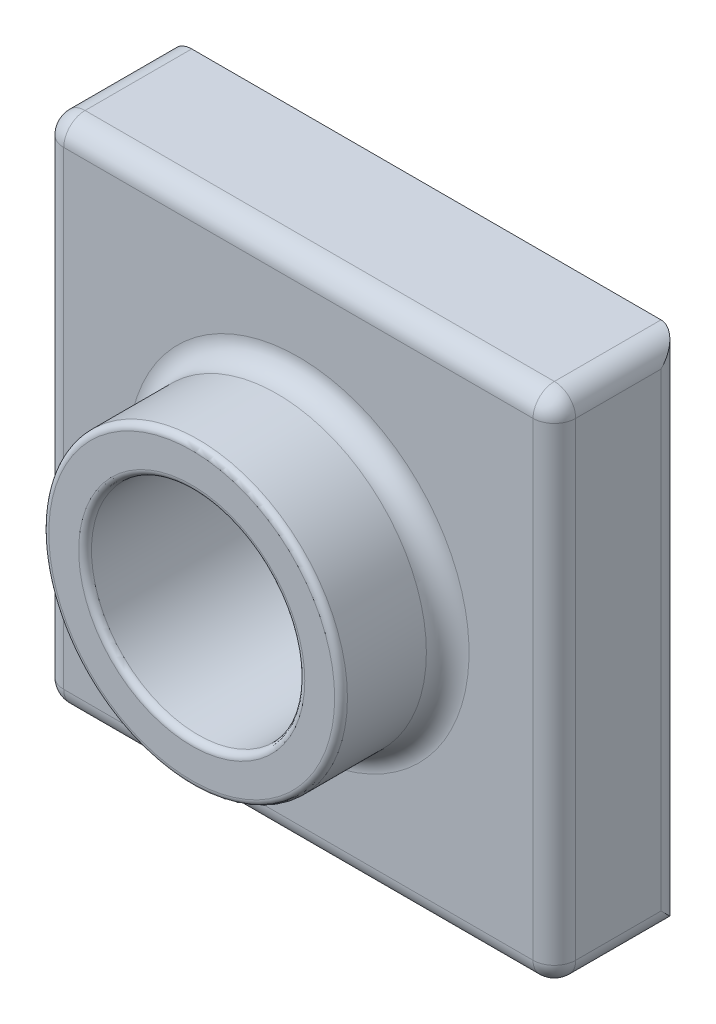
ISO-10303-21;
HEADER;
FILE_DESCRIPTION(('STEP AP214'),'2;1');
FILE_NAME('part.step','',(''),(''),'','','');
FILE_SCHEMA(('AUTOMOTIVE_DESIGN { 1 0 10303 214 1 1 1 1 }'));
ENDSEC;
DATA;
#1=APPLICATION_CONTEXT('core data for automotive mechanical design processes');
#2=APPLICATION_PROTOCOL_DEFINITION('international standard','automotive_design',2000,#1);
#3=PRODUCT_CONTEXT('',#1,'mechanical');
#4=PRODUCT('Part','Part','',(#3));
#5=PRODUCT_RELATED_PRODUCT_CATEGORY('part','',(#4));
#6=PRODUCT_DEFINITION_FORMATION('','',#4);
#7=PRODUCT_DEFINITION_CONTEXT('part definition',#1,'design');
#8=PRODUCT_DEFINITION('design','',#6,#7);
#9=PRODUCT_DEFINITION_SHAPE('','',#8);
#10=(LENGTH_UNIT() NAMED_UNIT(*) SI_UNIT(.MILLI.,.METRE.));
#11=(NAMED_UNIT(*) PLANE_ANGLE_UNIT() SI_UNIT($,.RADIAN.));
#12=(NAMED_UNIT(*) SI_UNIT($,.STERADIAN.) SOLID_ANGLE_UNIT());
#13=UNCERTAINTY_MEASURE_WITH_UNIT(LENGTH_MEASURE(1.E-05),#10,'distance_accuracy_value','');
#14=(GEOMETRIC_REPRESENTATION_CONTEXT(3) GLOBAL_UNCERTAINTY_ASSIGNED_CONTEXT((#13)) GLOBAL_UNIT_ASSIGNED_CONTEXT((#10,
#11,#12)) REPRESENTATION_CONTEXT('',''));
#15=CARTESIAN_POINT('',(0.,0.,0.));
#16=DIRECTION('',(0.,0.,1.));
#17=DIRECTION('',(1.,0.,0.));
#18=AXIS2_PLACEMENT_3D('',#15,#16,#17);
#19=CARTESIAN_POINT('',(0.,0.,0.));
#20=DIRECTION('',(0.,0.,-1.));
#21=DIRECTION('',(-1.,0.,0.));
#22=AXIS2_PLACEMENT_3D('',#19,#20,#21);
#23=PLANE('',#22);
#24=DIRECTION('',(0.,1.,0.));
#25=VECTOR('',#24,1.);
#26=CARTESIAN_POINT('',(115.,0.,0.));
#27=LINE('',#26,#25);
#28=CARTESIAN_POINT('',(115.,120.,0.));
#29=VERTEX_POINT('',#28);
#30=CARTESIAN_POINT('',(115.,118.,0.));
#31=VERTEX_POINT('',#30);
#32=EDGE_CURVE('E384',#29,#31,#27,.F.);
#33=ORIENTED_EDGE('',*,*,#32,.T.);
#34=DIRECTION('',(-1.,0.,0.));
#35=VECTOR('',#34,1.);
#36=CARTESIAN_POINT('',(0.,118.,0.));
#37=LINE('',#36,#35);
#38=CARTESIAN_POINT('',(4.99999999999998,118.,0.));
#39=VERTEX_POINT('',#38);
#40=EDGE_CURVE('E262',#31,#39,#37,.T.);
#41=ORIENTED_EDGE('',*,*,#40,.T.);
#42=CARTESIAN_POINT('',(4.99999999999999,115.,0.));
#43=DIRECTION('',(0.,0.,-1.));
#44=DIRECTION('',(-1.,0.,0.));
#45=AXIS2_PLACEMENT_3D('',#42,#43,#44);
#46=CIRCLE('',#45,3.);
#47=CARTESIAN_POINT('',(1.99999999999999,115.,0.));
#48=VERTEX_POINT('',#47);
#49=EDGE_CURVE('E303',#48,#39,#46,.T.);
#50=ORIENTED_EDGE('',*,*,#49,.F.);
#51=DIRECTION('',(0.,-1.,0.));
#52=VECTOR('',#51,1.);
#53=CARTESIAN_POINT('',(2.,0.,0.));
#54=LINE('',#53,#52);
#55=CARTESIAN_POINT('',(2.,5.,0.));
#56=VERTEX_POINT('',#55);
#57=EDGE_CURVE('E61',#48,#56,#54,.T.);
#58=ORIENTED_EDGE('',*,*,#57,.T.);
#59=CARTESIAN_POINT('',(5.,5.,0.));
#60=DIRECTION('',(0.,0.,-1.));
#61=DIRECTION('',(-1.,0.,0.));
#62=AXIS2_PLACEMENT_3D('',#59,#60,#61);
#63=CIRCLE('',#62,3.);
#64=CARTESIAN_POINT('',(5.,2.,0.));
#65=VERTEX_POINT('',#64);
#66=EDGE_CURVE('E196',#65,#56,#63,.T.);
#67=ORIENTED_EDGE('',*,*,#66,.F.);
#68=DIRECTION('',(1.,0.,0.));
#69=VECTOR('',#68,1.);
#70=CARTESIAN_POINT('',(0.,2.,0.));
#71=LINE('',#70,#69);
#72=CARTESIAN_POINT('',(115.,2.,0.));
#73=VERTEX_POINT('',#72);
#74=EDGE_CURVE('E298',#65,#73,#71,.T.);
#75=ORIENTED_EDGE('',*,*,#74,.T.);
#76=CARTESIAN_POINT('',(115.,0.,0.));
#77=VERTEX_POINT('',#76);
#78=EDGE_CURVE('E383',#73,#77,#27,.F.);
#79=ORIENTED_EDGE('',*,*,#78,.T.);
#80=DIRECTION('',(1.,0.,0.));
#81=VECTOR('',#80,1.);
#82=CARTESIAN_POINT('',(0.,0.,0.));
#83=LINE('',#82,#81);
#84=CARTESIAN_POINT('',(5.,0.,0.));
#85=VERTEX_POINT('',#84);
#86=EDGE_CURVE('E337',#85,#77,#83,.T.);
#87=ORIENTED_EDGE('',*,*,#86,.F.);
#88=CARTESIAN_POINT('',(5.,5.,0.));
#89=DIRECTION('',(0.,0.,-1.));
#90=DIRECTION('',(-1.,0.,0.));
#91=AXIS2_PLACEMENT_3D('',#88,#89,#90);
#92=CIRCLE('',#91,5.);
#93=CARTESIAN_POINT('',(0.,5.,0.));
#94=VERTEX_POINT('',#93);
#95=EDGE_CURVE('E381',#85,#94,#92,.T.);
#96=ORIENTED_EDGE('',*,*,#95,.T.);
#97=DIRECTION('',(0.,-1.,0.));
#98=VECTOR('',#97,1.);
#99=CARTESIAN_POINT('',(0.,0.,0.));
#100=LINE('',#99,#98);
#101=CARTESIAN_POINT('',(0.,115.,0.));
#102=VERTEX_POINT('',#101);
#103=EDGE_CURVE('E331',#102,#94,#100,.T.);
#104=ORIENTED_EDGE('',*,*,#103,.F.);
#105=CARTESIAN_POINT('',(4.99999999999999,115.,0.));
#106=DIRECTION('',(0.,0.,-1.));
#107=DIRECTION('',(-1.,0.,0.));
#108=AXIS2_PLACEMENT_3D('',#105,#106,#107);
#109=CIRCLE('',#108,5.);
#110=CARTESIAN_POINT('',(4.99999999999999,120.,0.));
#111=VERTEX_POINT('',#110);
#112=EDGE_CURVE('E378',#102,#111,#109,.T.);
#113=ORIENTED_EDGE('',*,*,#112,.T.);
#114=DIRECTION('',(-1.,0.,0.));
#115=VECTOR('',#114,1.);
#116=CARTESIAN_POINT('',(0.,120.,0.));
#117=LINE('',#116,#115);
#118=EDGE_CURVE('E345',#29,#111,#117,.T.);
#119=ORIENTED_EDGE('',*,*,#118,.F.);
#120=EDGE_LOOP('',(#33,#41,#50,#58,#67,#75,#79,#87,#96,#104,#113,#119));
#121=FACE_BOUND('',#120,.T.);
#122=ADVANCED_FACE('F44',(#121),#23,.T.);
#123=CARTESIAN_POINT('',(0.,0.,30.));
#124=DIRECTION('',(1.,0.,0.));
#125=DIRECTION('',(0.,1.,0.));
#126=AXIS2_PLACEMENT_3D('',#123,#124,#125);
#127=PLANE('',#126);
#128=ORIENTED_EDGE('',*,*,#103,.T.);
#129=DIRECTION('',(0.,0.,-1.));
#130=VECTOR('',#129,1.);
#131=CARTESIAN_POINT('',(0.,5.,30.));
#132=LINE('',#131,#130);
#133=CARTESIAN_POINT('',(0.,5.,25.));
#134=VERTEX_POINT('',#133);
#135=EDGE_CURVE('E69',#94,#134,#132,.F.);
#136=ORIENTED_EDGE('',*,*,#135,.T.);
#137=DIRECTION('',(0.,-1.,0.));
#138=VECTOR('',#137,1.);
#139=CARTESIAN_POINT('',(0.,0.,25.));
#140=LINE('',#139,#138);
#141=CARTESIAN_POINT('',(0.,115.,25.));
#142=VERTEX_POINT('',#141);
#143=EDGE_CURVE('E408',#134,#142,#140,.F.);
#144=ORIENTED_EDGE('',*,*,#143,.T.);
#145=DIRECTION('',(0.,0.,-1.));
#146=VECTOR('',#145,1.);
#147=CARTESIAN_POINT('',(0.,115.,30.));
#148=LINE('',#147,#146);
#149=EDGE_CURVE('E406',#142,#102,#148,.T.);
#150=ORIENTED_EDGE('',*,*,#149,.T.);
#151=EDGE_LOOP('',(#128,#136,#144,#150));
#152=FACE_BOUND('',#151,.T.);
#153=ADVANCED_FACE('F522',(#152),#127,.F.);
#154=CARTESIAN_POINT('',(0.,0.,30.));
#155=DIRECTION('',(0.,1.,0.));
#156=DIRECTION('',(0.,0.,1.));
#157=AXIS2_PLACEMENT_3D('',#154,#155,#156);
#158=PLANE('',#157);
#159=ORIENTED_EDGE('',*,*,#86,.T.);
#160=DIRECTION('',(0.,0.,-1.));
#161=VECTOR('',#160,1.);
#162=CARTESIAN_POINT('',(115.,0.,30.));
#163=LINE('',#162,#161);
#164=CARTESIAN_POINT('',(115.,0.,25.));
#165=VERTEX_POINT('',#164);
#166=EDGE_CURVE('E364',#77,#165,#163,.F.);
#167=ORIENTED_EDGE('',*,*,#166,.T.);
#168=DIRECTION('',(1.,0.,0.));
#169=VECTOR('',#168,1.);
#170=CARTESIAN_POINT('',(0.,0.,25.));
#171=LINE('',#170,#169);
#172=CARTESIAN_POINT('',(5.,0.,25.));
#173=VERTEX_POINT('',#172);
#174=EDGE_CURVE('E362',#165,#173,#171,.F.);
#175=ORIENTED_EDGE('',*,*,#174,.T.);
#176=DIRECTION('',(0.,0.,-1.));
#177=VECTOR('',#176,1.);
#178=CARTESIAN_POINT('',(5.,0.,30.));
#179=LINE('',#178,#177);
#180=EDGE_CURVE('E359',#173,#85,#179,.T.);
#181=ORIENTED_EDGE('',*,*,#180,.T.);
#182=EDGE_LOOP('',(#159,#167,#175,#181));
#183=FACE_BOUND('',#182,.T.);
#184=ADVANCED_FACE('F529',(#183),#158,.F.);
#185=CARTESIAN_POINT('',(120.,0.,30.));
#186=DIRECTION('',(-1.,0.,0.));
#187=DIRECTION('',(0.,-1.,0.));
#188=AXIS2_PLACEMENT_3D('',#185,#186,#187);
#189=PLANE('',#188);
#190=DIRECTION('',(0.,0.,-1.));
#191=VECTOR('',#190,1.);
#192=CARTESIAN_POINT('',(120.,5.,30.));
#193=LINE('',#192,#191);
#194=CARTESIAN_POINT('',(120.,5.,25.));
#195=VERTEX_POINT('',#194);
#196=CARTESIAN_POINT('',(120.,5.,5.));
#197=VERTEX_POINT('',#196);
#198=EDGE_CURVE('E355',#195,#197,#193,.T.);
#199=ORIENTED_EDGE('',*,*,#198,.T.);
#200=DIRECTION('',(0.,1.,0.));
#201=VECTOR('',#200,1.);
#202=CARTESIAN_POINT('',(120.,120.,5.));
#203=LINE('',#202,#201);
#204=CARTESIAN_POINT('',(120.,115.,5.));
#205=VERTEX_POINT('',#204);
#206=EDGE_CURVE('E358',#197,#205,#203,.T.);
#207=ORIENTED_EDGE('',*,*,#206,.T.);
#208=DIRECTION('',(0.,0.,-1.));
#209=VECTOR('',#208,1.);
#210=CARTESIAN_POINT('',(120.,115.,30.));
#211=LINE('',#210,#209);
#212=CARTESIAN_POINT('',(120.,115.,25.));
#213=VERTEX_POINT('',#212);
#214=EDGE_CURVE('E349',#205,#213,#211,.F.);
#215=ORIENTED_EDGE('',*,*,#214,.T.);
#216=DIRECTION('',(0.,1.,0.));
#217=VECTOR('',#216,1.);
#218=CARTESIAN_POINT('',(120.,0.,25.));
#219=LINE('',#218,#217);
#220=EDGE_CURVE('E347',#213,#195,#219,.F.);
#221=ORIENTED_EDGE('',*,*,#220,.T.);
#222=EDGE_LOOP('',(#199,#207,#215,#221));
#223=FACE_BOUND('',#222,.T.);
#224=ADVANCED_FACE('F990',(#223),#189,.F.);
#225=CARTESIAN_POINT('',(0.,120.,30.));
#226=DIRECTION('',(0.,-1.,0.));
#227=DIRECTION('',(0.,0.,-1.));
#228=AXIS2_PLACEMENT_3D('',#225,#226,#227);
#229=PLANE('',#228);
#230=DIRECTION('',(-1.,0.,0.));
#231=VECTOR('',#230,1.);
#232=CARTESIAN_POINT('',(0.,120.,25.));
#233=LINE('',#232,#231);
#234=CARTESIAN_POINT('',(4.99999999999999,120.,25.));
#235=VERTEX_POINT('',#234);
#236=CARTESIAN_POINT('',(115.,120.,25.));
#237=VERTEX_POINT('',#236);
#238=EDGE_CURVE('E375',#235,#237,#233,.F.);
#239=ORIENTED_EDGE('',*,*,#238,.T.);
#240=DIRECTION('',(0.,0.,-1.));
#241=VECTOR('',#240,1.);
#242=CARTESIAN_POINT('',(115.,120.,30.));
#243=LINE('',#242,#241);
#244=EDGE_CURVE('E374',#237,#29,#243,.T.);
#245=ORIENTED_EDGE('',*,*,#244,.T.);
#246=ORIENTED_EDGE('',*,*,#118,.T.);
#247=DIRECTION('',(0.,0.,-1.));
#248=VECTOR('',#247,1.);
#249=CARTESIAN_POINT('',(4.99999999999999,120.,30.));
#250=LINE('',#249,#248);
#251=EDGE_CURVE('E369',#111,#235,#250,.F.);
#252=ORIENTED_EDGE('',*,*,#251,.T.);
#253=EDGE_LOOP('',(#239,#245,#246,#252));
#254=FACE_BOUND('',#253,.T.);
#255=ADVANCED_FACE('F519',(#254),#229,.F.);
#256=CARTESIAN_POINT('',(0.,0.,30.));
#257=DIRECTION('',(0.,0.,-1.));
#258=DIRECTION('',(-1.,0.,0.));
#259=AXIS2_PLACEMENT_3D('',#256,#257,#258);
#260=PLANE('',#259);
#261=DIRECTION('',(0.,1.,0.));
#262=VECTOR('',#261,1.);
#263=CARTESIAN_POINT('',(115.,0.,30.));
#264=LINE('',#263,#262);
#265=CARTESIAN_POINT('',(115.,5.,30.));
#266=VERTEX_POINT('',#265);
#267=CARTESIAN_POINT('',(115.,115.,30.));
#268=VERTEX_POINT('',#267);
#269=EDGE_CURVE('E399',#266,#268,#264,.T.);
#270=ORIENTED_EDGE('',*,*,#269,.T.);
#271=DIRECTION('',(-1.,0.,0.));
#272=VECTOR('',#271,1.);
#273=CARTESIAN_POINT('',(0.,115.,30.));
#274=LINE('',#273,#272);
#275=CARTESIAN_POINT('',(4.99999999999999,115.,30.));
#276=VERTEX_POINT('',#275);
#277=EDGE_CURVE('E405',#268,#276,#274,.T.);
#278=ORIENTED_EDGE('',*,*,#277,.T.);
#279=DIRECTION('',(0.,-1.,0.));
#280=VECTOR('',#279,1.);
#281=CARTESIAN_POINT('',(5.,0.,30.));
#282=LINE('',#281,#280);
#283=CARTESIAN_POINT('',(5.,5.,30.));
#284=VERTEX_POINT('',#283);
#285=EDGE_CURVE('E392',#276,#284,#282,.T.);
#286=ORIENTED_EDGE('',*,*,#285,.T.);
#287=DIRECTION('',(1.,0.,0.));
#288=VECTOR('',#287,1.);
#289=CARTESIAN_POINT('',(0.,5.,30.));
#290=LINE('',#289,#288);
#291=EDGE_CURVE('E398',#284,#266,#290,.T.);
#292=ORIENTED_EDGE('',*,*,#291,.T.);
#293=EDGE_LOOP('',(#270,#278,#286,#292));
#294=FACE_BOUND('',#293,.T.);
#295=CARTESIAN_POINT('',(60.,60.,30.));
#296=DIRECTION('',(0.,0.,-1.));
#297=DIRECTION('',(-1.,0.,0.));
#298=AXIS2_PLACEMENT_3D('',#295,#296,#297);
#299=CIRCLE('',#298,40.);
#300=CARTESIAN_POINT('',(20.,60.,30.));
#301=VERTEX_POINT('',#300);
#302=EDGE_CURVE('E386',#301,#301,#299,.T.);
#303=ORIENTED_EDGE('',*,*,#302,.T.);
#304=EDGE_LOOP('',(#303));
#305=FACE_BOUND('',#304,.T.);
#306=ADVANCED_FACE('F507',(#294,#305),#260,.F.);
#307=CARTESIAN_POINT('',(60.,60.,0.));
#308=DIRECTION('',(0.,0.,-1.));
#309=DIRECTION('',(-1.,0.,0.));
#310=AXIS2_PLACEMENT_3D('',#307,#308,#309);
#311=CIRCLE('',#310,27.);
#312=CARTESIAN_POINT('',(33.,60.,0.));
#313=VERTEX_POINT('',#312);
#314=EDGE_CURVE('E299',#313,#313,#311,.F.);
#315=ORIENTED_EDGE('',*,*,#314,.F.);
#316=EDGE_LOOP('',(#315));
#317=FACE_BOUND('',#316,.T.);
#318=CARTESIAN_POINT('',(60.,60.,0.));
#319=DIRECTION('',(0.,0.,1.));
#320=DIRECTION('',(1.,0.,0.));
#321=AXIS2_PLACEMENT_3D('',#318,#319,#320);
#322=CIRCLE('',#321,25.);
#323=CARTESIAN_POINT('',(85.,60.,0.));
#324=VERTEX_POINT('',#323);
#325=EDGE_CURVE('E329',#324,#324,#322,.T.);
#326=ORIENTED_EDGE('',*,*,#325,.T.);
#327=EDGE_LOOP('',(#326));
#328=FACE_BOUND('',#327,.T.);
#329=ADVANCED_FACE('F506',(#317,#328),#23,.T.);
#330=CARTESIAN_POINT('',(60.,60.,55.));
#331=DIRECTION('',(0.,0.,-1.));
#332=DIRECTION('',(-1.,0.,0.));
#333=AXIS2_PLACEMENT_3D('',#330,#331,#332);
#334=CYLINDRICAL_SURFACE('',#333,35.);
#335=CARTESIAN_POINT('',(60.,60.,53.5));
#336=DIRECTION('',(0.,0.,1.));
#337=DIRECTION('',(1.,0.,0.));
#338=AXIS2_PLACEMENT_3D('',#335,#336,#337);
#339=CIRCLE('',#338,35.);
#340=CARTESIAN_POINT('',(95.,60.,53.5));
#341=VERTEX_POINT('',#340);
#342=EDGE_CURVE('E53',#341,#341,#339,.F.);
#343=ORIENTED_EDGE('',*,*,#342,.T.);
#344=EDGE_LOOP('',(#343));
#345=FACE_BOUND('',#344,.T.);
#346=CARTESIAN_POINT('',(60.,60.,35.));
#347=DIRECTION('',(0.,0.,-1.));
#348=DIRECTION('',(-1.,0.,0.));
#349=AXIS2_PLACEMENT_3D('',#346,#347,#348);
#350=CIRCLE('',#349,35.);
#351=CARTESIAN_POINT('',(25.,60.,35.));
#352=VERTEX_POINT('',#351);
#353=EDGE_CURVE('E414',#352,#352,#350,.F.);
#354=ORIENTED_EDGE('',*,*,#353,.T.);
#355=EDGE_LOOP('',(#354));
#356=FACE_BOUND('',#355,.T.);
#357=ADVANCED_FACE('F481',(#345,#356),#334,.T.);
#358=CARTESIAN_POINT('',(60.,60.,55.));
#359=DIRECTION('',(0.,0.,1.));
#360=DIRECTION('',(1.,0.,0.));
#361=AXIS2_PLACEMENT_3D('',#358,#359,#360);
#362=PLANE('',#361);
#363=CARTESIAN_POINT('',(60.,60.,55.));
#364=DIRECTION('',(0.,0.,1.));
#365=DIRECTION('',(1.,0.,0.));
#366=AXIS2_PLACEMENT_3D('',#363,#364,#365);
#367=CIRCLE('',#366,33.5);
#368=CARTESIAN_POINT('',(93.5,60.,55.));
#369=VERTEX_POINT('',#368);
#370=EDGE_CURVE('E475',#369,#369,#367,.T.);
#371=ORIENTED_EDGE('',*,*,#370,.T.);
#372=EDGE_LOOP('',(#371));
#373=FACE_BOUND('',#372,.T.);
#374=CARTESIAN_POINT('',(60.,60.,55.));
#375=DIRECTION('',(0.,0.,1.));
#376=DIRECTION('',(1.,0.,0.));
#377=AXIS2_PLACEMENT_3D('',#374,#375,#376);
#378=CIRCLE('',#377,26.5);
#379=CARTESIAN_POINT('',(86.5,60.,55.));
#380=VERTEX_POINT('',#379);
#381=EDGE_CURVE('E416',#380,#380,#378,.F.);
#382=ORIENTED_EDGE('',*,*,#381,.T.);
#383=EDGE_LOOP('',(#382));
#384=FACE_BOUND('',#383,.T.);
#385=ADVANCED_FACE('F489',(#373,#384),#362,.T.);
#386=CARTESIAN_POINT('',(60.,60.,0.));
#387=DIRECTION('',(0.,0.,1.));
#388=DIRECTION('',(1.,0.,0.));
#389=AXIS2_PLACEMENT_3D('',#386,#387,#388);
#390=CYLINDRICAL_SURFACE('',#389,25.);
#391=CARTESIAN_POINT('',(60.,60.,53.5));
#392=DIRECTION('',(0.,0.,1.));
#393=DIRECTION('',(1.,0.,0.));
#394=AXIS2_PLACEMENT_3D('',#391,#392,#393);
#395=CIRCLE('',#394,25.);
#396=CARTESIAN_POINT('',(85.,60.,53.5));
#397=VERTEX_POINT('',#396);
#398=EDGE_CURVE('E11',#397,#397,#395,.T.);
#399=ORIENTED_EDGE('',*,*,#398,.T.);
#400=EDGE_LOOP('',(#399));
#401=FACE_BOUND('',#400,.T.);
#402=ORIENTED_EDGE('',*,*,#325,.F.);
#403=EDGE_LOOP('',(#402));
#404=FACE_BOUND('',#403,.T.);
#405=ADVANCED_FACE('F492',(#401,#404),#390,.F.);
#406=CARTESIAN_POINT('',(4.99999999999999,115.,30.));
#407=DIRECTION('',(0.,0.,-1.));
#408=DIRECTION('',(-1.,0.,0.));
#409=AXIS2_PLACEMENT_3D('',#406,#407,#408);
#410=CYLINDRICAL_SURFACE('',#409,5.);
#411=CARTESIAN_POINT('',(4.99999999999999,115.,25.));
#412=DIRECTION('',(0.,0.,1.));
#413=DIRECTION('',(1.,0.,0.));
#414=AXIS2_PLACEMENT_3D('',#411,#412,#413);
#415=CIRCLE('',#414,5.);
#416=EDGE_CURVE('E333',#235,#142,#415,.T.);
#417=ORIENTED_EDGE('',*,*,#416,.F.);
#418=ORIENTED_EDGE('',*,*,#251,.F.);
#419=ORIENTED_EDGE('',*,*,#112,.F.);
#420=ORIENTED_EDGE('',*,*,#149,.F.);
#421=EDGE_LOOP('',(#417,#418,#419,#420));
#422=FACE_BOUND('',#421,.T.);
#423=ADVANCED_FACE('F503',(#422),#410,.T.);
#424=CARTESIAN_POINT('',(4.99999999999999,115.,25.));
#425=DIRECTION('',(-1.,0.,0.));
#426=DIRECTION('',(0.,0.,1.));
#427=AXIS2_PLACEMENT_3D('',#424,#425,#426);
#428=SPHERICAL_SURFACE('',#427,5.);
#429=CARTESIAN_POINT('',(4.99999999999999,115.,25.));
#430=DIRECTION('',(-1.,0.,0.));
#431=DIRECTION('',(0.,0.,1.));
#432=AXIS2_PLACEMENT_3D('',#429,#430,#431);
#433=CIRCLE('',#432,5.);
#434=EDGE_CURVE('E458',#235,#276,#433,.F.);
#435=ORIENTED_EDGE('',*,*,#434,.F.);
#436=ORIENTED_EDGE('',*,*,#416,.T.);
#437=CARTESIAN_POINT('',(4.99999999999999,115.,25.));
#438=DIRECTION('',(0.,1.,0.));
#439=DIRECTION('',(0.,0.,1.));
#440=AXIS2_PLACEMENT_3D('',#437,#438,#439);
#441=CIRCLE('',#440,5.);
#442=EDGE_CURVE('E463',#276,#142,#441,.F.);
#443=ORIENTED_EDGE('',*,*,#442,.F.);
#444=EDGE_LOOP('',(#435,#436,#443));
#445=FACE_BOUND('',#444,.T.);
#446=ADVANCED_FACE('F931',(#445),#428,.T.);
#447=CARTESIAN_POINT('',(5.,5.,30.));
#448=DIRECTION('',(0.,0.,-1.));
#449=DIRECTION('',(-1.,0.,0.));
#450=AXIS2_PLACEMENT_3D('',#447,#448,#449);
#451=CYLINDRICAL_SURFACE('',#450,5.);
#452=ORIENTED_EDGE('',*,*,#95,.F.);
#453=ORIENTED_EDGE('',*,*,#180,.F.);
#454=CARTESIAN_POINT('',(5.,5.,25.));
#455=DIRECTION('',(0.,0.,1.));
#456=DIRECTION('',(1.,0.,0.));
#457=AXIS2_PLACEMENT_3D('',#454,#455,#456);
#458=CIRCLE('',#457,5.);
#459=EDGE_CURVE('E457',#134,#173,#458,.T.);
#460=ORIENTED_EDGE('',*,*,#459,.F.);
#461=ORIENTED_EDGE('',*,*,#135,.F.);
#462=EDGE_LOOP('',(#452,#453,#460,#461));
#463=FACE_BOUND('',#462,.T.);
#464=ADVANCED_FACE('F921',(#463),#451,.T.);
#465=CARTESIAN_POINT('',(5.,0.,25.));
#466=DIRECTION('',(0.,-1.,0.));
#467=DIRECTION('',(1.,0.,0.));
#468=AXIS2_PLACEMENT_3D('',#465,#466,#467);
#469=CYLINDRICAL_SURFACE('',#468,5.);
#470=ORIENTED_EDGE('',*,*,#442,.T.);
#471=ORIENTED_EDGE('',*,*,#143,.F.);
#472=CARTESIAN_POINT('',(5.,5.,25.));
#473=DIRECTION('',(0.,-1.,0.));
#474=DIRECTION('',(1.,0.,0.));
#475=AXIS2_PLACEMENT_3D('',#472,#473,#474);
#476=CIRCLE('',#475,5.);
#477=EDGE_CURVE('E455',#284,#134,#476,.T.);
#478=ORIENTED_EDGE('',*,*,#477,.F.);
#479=ORIENTED_EDGE('',*,*,#285,.F.);
#480=EDGE_LOOP('',(#470,#471,#478,#479));
#481=FACE_BOUND('',#480,.T.);
#482=ADVANCED_FACE('F913',(#481),#469,.T.);
#483=CARTESIAN_POINT('',(0.,115.,25.));
#484=DIRECTION('',(-1.,0.,0.));
#485=DIRECTION('',(0.,0.,1.));
#486=AXIS2_PLACEMENT_3D('',#483,#484,#485);
#487=CYLINDRICAL_SURFACE('',#486,5.);
#488=ORIENTED_EDGE('',*,*,#434,.T.);
#489=ORIENTED_EDGE('',*,*,#277,.F.);
#490=CARTESIAN_POINT('',(115.,115.,25.));
#491=DIRECTION('',(1.,0.,0.));
#492=DIRECTION('',(0.,0.,-1.));
#493=AXIS2_PLACEMENT_3D('',#490,#491,#492);
#494=CIRCLE('',#493,5.);
#495=EDGE_CURVE('E447',#237,#268,#494,.T.);
#496=ORIENTED_EDGE('',*,*,#495,.F.);
#497=ORIENTED_EDGE('',*,*,#238,.F.);
#498=EDGE_LOOP('',(#488,#489,#496,#497));
#499=FACE_BOUND('',#498,.T.);
#500=ADVANCED_FACE('F901',(#499),#487,.T.);
#501=CARTESIAN_POINT('',(5.,5.,25.));
#502=DIRECTION('',(-1.,0.,0.));
#503=DIRECTION('',(0.,-1.,0.));
#504=AXIS2_PLACEMENT_3D('',#501,#502,#503);
#505=SPHERICAL_SURFACE('',#504,5.);
#506=ORIENTED_EDGE('',*,*,#477,.T.);
#507=ORIENTED_EDGE('',*,*,#459,.T.);
#508=CARTESIAN_POINT('',(5.,5.,25.));
#509=DIRECTION('',(-1.,0.,0.));
#510=DIRECTION('',(0.,0.,1.));
#511=AXIS2_PLACEMENT_3D('',#508,#509,#510);
#512=CIRCLE('',#511,5.);
#513=EDGE_CURVE('E441',#284,#173,#512,.F.);
#514=ORIENTED_EDGE('',*,*,#513,.F.);
#515=EDGE_LOOP('',(#506,#507,#514));
#516=FACE_BOUND('',#515,.T.);
#517=ADVANCED_FACE('F893',(#516),#505,.T.);
#518=CARTESIAN_POINT('',(115.,115.,25.));
#519=DIRECTION('',(0.,0.,1.));
#520=DIRECTION('',(1.,0.,0.));
#521=AXIS2_PLACEMENT_3D('',#518,#519,#520);
#522=SPHERICAL_SURFACE('',#521,5.);
#523=CARTESIAN_POINT('',(115.,115.,25.));
#524=DIRECTION('',(0.,0.,1.));
#525=DIRECTION('',(1.,0.,0.));
#526=AXIS2_PLACEMENT_3D('',#523,#524,#525);
#527=CIRCLE('',#526,5.);
#528=EDGE_CURVE('E436',#237,#213,#527,.F.);
#529=ORIENTED_EDGE('',*,*,#528,.F.);
#530=ORIENTED_EDGE('',*,*,#495,.T.);
#531=CARTESIAN_POINT('',(115.,115.,25.));
#532=DIRECTION('',(0.,1.,0.));
#533=DIRECTION('',(0.,0.,1.));
#534=AXIS2_PLACEMENT_3D('',#531,#532,#533);
#535=CIRCLE('',#534,5.);
#536=EDGE_CURVE('E439',#213,#268,#535,.F.);
#537=ORIENTED_EDGE('',*,*,#536,.F.);
#538=EDGE_LOOP('',(#529,#530,#537));
#539=FACE_BOUND('',#538,.T.);
#540=ADVANCED_FACE('F882',(#539),#522,.T.);
#541=CARTESIAN_POINT('',(0.,5.,25.));
#542=DIRECTION('',(1.,0.,0.));
#543=DIRECTION('',(0.,0.,-1.));
#544=AXIS2_PLACEMENT_3D('',#541,#542,#543);
#545=CYLINDRICAL_SURFACE('',#544,5.);
#546=ORIENTED_EDGE('',*,*,#513,.T.);
#547=ORIENTED_EDGE('',*,*,#174,.F.);
#548=CARTESIAN_POINT('',(115.,5.,25.));
#549=DIRECTION('',(1.,0.,0.));
#550=DIRECTION('',(0.,0.,-1.));
#551=AXIS2_PLACEMENT_3D('',#548,#549,#550);
#552=CIRCLE('',#551,5.);
#553=EDGE_CURVE('E435',#266,#165,#552,.T.);
#554=ORIENTED_EDGE('',*,*,#553,.F.);
#555=ORIENTED_EDGE('',*,*,#291,.F.);
#556=EDGE_LOOP('',(#546,#547,#554,#555));
#557=FACE_BOUND('',#556,.T.);
#558=ADVANCED_FACE('F871',(#557),#545,.T.);
#559=CARTESIAN_POINT('',(115.,0.,25.));
#560=DIRECTION('',(0.,1.,0.));
#561=DIRECTION('',(-1.,0.,0.));
#562=AXIS2_PLACEMENT_3D('',#559,#560,#561);
#563=CYLINDRICAL_SURFACE('',#562,5.);
#564=ORIENTED_EDGE('',*,*,#536,.T.);
#565=ORIENTED_EDGE('',*,*,#269,.F.);
#566=CARTESIAN_POINT('',(115.,5.,25.));
#567=DIRECTION('',(0.,-1.,0.));
#568=DIRECTION('',(1.,0.,0.));
#569=AXIS2_PLACEMENT_3D('',#566,#567,#568);
#570=CIRCLE('',#569,5.);
#571=EDGE_CURVE('E428',#195,#266,#570,.T.);
#572=ORIENTED_EDGE('',*,*,#571,.F.);
#573=ORIENTED_EDGE('',*,*,#220,.F.);
#574=EDGE_LOOP('',(#564,#565,#572,#573));
#575=FACE_BOUND('',#574,.T.);
#576=ADVANCED_FACE('F863',(#575),#563,.T.);
#577=CARTESIAN_POINT('',(115.,115.,30.));
#578=DIRECTION('',(0.,0.,-1.));
#579=DIRECTION('',(-1.,0.,0.));
#580=AXIS2_PLACEMENT_3D('',#577,#578,#579);
#581=CYLINDRICAL_SURFACE('',#580,5.);
#582=ORIENTED_EDGE('',*,*,#528,.T.);
#583=ORIENTED_EDGE('',*,*,#214,.F.);
#584=CARTESIAN_POINT('',(115.,115.,5.));
#585=DIRECTION('',(0.,-0.707106781186547,-0.707106781186547));
#586=DIRECTION('',(0.,-0.707106781186547,0.707106781186547));
#587=AXIS2_PLACEMENT_3D('',#584,#585,#586);
#588=ELLIPSE('',#587,7.07106781186547,5.);
#589=EDGE_CURVE('E424',#29,#205,#588,.T.);
#590=ORIENTED_EDGE('',*,*,#589,.F.);
#591=ORIENTED_EDGE('',*,*,#244,.F.);
#592=EDGE_LOOP('',(#582,#583,#590,#591));
#593=FACE_BOUND('',#592,.T.);
#594=ADVANCED_FACE('F853',(#593),#581,.T.);
#595=CARTESIAN_POINT('',(115.,5.,25.));
#596=DIRECTION('',(0.,0.,1.));
#597=DIRECTION('',(1.,0.,0.));
#598=AXIS2_PLACEMENT_3D('',#595,#596,#597);
#599=SPHERICAL_SURFACE('',#598,5.);
#600=ORIENTED_EDGE('',*,*,#571,.T.);
#601=ORIENTED_EDGE('',*,*,#553,.T.);
#602=CARTESIAN_POINT('',(115.,5.,25.));
#603=DIRECTION('',(0.,0.,1.));
#604=DIRECTION('',(1.,0.,0.));
#605=AXIS2_PLACEMENT_3D('',#602,#603,#604);
#606=CIRCLE('',#605,5.);
#607=EDGE_CURVE('E423',#195,#165,#606,.F.);
#608=ORIENTED_EDGE('',*,*,#607,.F.);
#609=EDGE_LOOP('',(#600,#601,#608));
#610=FACE_BOUND('',#609,.T.);
#611=ADVANCED_FACE('F841',(#610),#599,.T.);
#612=CARTESIAN_POINT('',(115.,0.,5.));
#613=DIRECTION('',(0.,-1.,0.));
#614=DIRECTION('',(1.,0.,0.));
#615=AXIS2_PLACEMENT_3D('',#612,#613,#614);
#616=CYLINDRICAL_SURFACE('',#615,5.);
#617=ORIENTED_EDGE('',*,*,#589,.T.);
#618=ORIENTED_EDGE('',*,*,#206,.F.);
#619=CARTESIAN_POINT('',(115.,5.,5.));
#620=DIRECTION('',(0.,-0.707106781186547,0.707106781186547));
#621=DIRECTION('',(0.,-0.707106781186547,-0.707106781186547));
#622=AXIS2_PLACEMENT_3D('',#619,#620,#621);
#623=ELLIPSE('',#622,7.07106781186547,5.);
#624=EDGE_CURVE('E315',#77,#197,#623,.T.);
#625=ORIENTED_EDGE('',*,*,#624,.F.);
#626=ORIENTED_EDGE('',*,*,#78,.F.);
#627=DIRECTION('',(0.,1.,0.));
#628=VECTOR('',#627,1.);
#629=CARTESIAN_POINT('',(115.,0.,0.));
#630=LINE('',#629,#628);
#631=EDGE_CURVE('E325',#31,#73,#630,.F.);
#632=ORIENTED_EDGE('',*,*,#631,.F.);
#633=ORIENTED_EDGE('',*,*,#32,.F.);
#634=EDGE_LOOP('',(#617,#618,#625,#626,#632,#633));
#635=FACE_BOUND('',#634,.T.);
#636=ADVANCED_FACE('F538',(#635),#616,.T.);
#637=CARTESIAN_POINT('',(115.,5.,30.));
#638=DIRECTION('',(0.,0.,-1.));
#639=DIRECTION('',(-1.,0.,0.));
#640=AXIS2_PLACEMENT_3D('',#637,#638,#639);
#641=CYLINDRICAL_SURFACE('',#640,5.);
#642=ORIENTED_EDGE('',*,*,#607,.T.);
#643=ORIENTED_EDGE('',*,*,#166,.F.);
#644=ORIENTED_EDGE('',*,*,#624,.T.);
#645=ORIENTED_EDGE('',*,*,#198,.F.);
#646=EDGE_LOOP('',(#642,#643,#644,#645));
#647=FACE_BOUND('',#646,.T.);
#648=ADVANCED_FACE('F823',(#647),#641,.T.);
#649=CARTESIAN_POINT('',(60.,60.,35.));
#650=DIRECTION('',(0.,0.,-1.));
#651=DIRECTION('',(-1.,0.,0.));
#652=AXIS2_PLACEMENT_3D('',#649,#650,#651);
#653=TOROIDAL_SURFACE('',#652,40.,5.);
#654=ORIENTED_EDGE('',*,*,#302,.F.);
#655=EDGE_LOOP('',(#654));
#656=FACE_BOUND('',#655,.T.);
#657=ORIENTED_EDGE('',*,*,#353,.F.);
#658=EDGE_LOOP('',(#657));
#659=FACE_BOUND('',#658,.T.);
#660=ADVANCED_FACE('F490',(#656,#659),#653,.F.);
#661=CARTESIAN_POINT('',(60.,60.,53.5));
#662=DIRECTION('',(0.,0.,1.));
#663=DIRECTION('',(1.,0.,0.));
#664=AXIS2_PLACEMENT_3D('',#661,#662,#663);
#665=TOROIDAL_SURFACE('',#664,33.5,1.5);
#666=ORIENTED_EDGE('',*,*,#342,.F.);
#667=EDGE_LOOP('',(#666));
#668=FACE_BOUND('',#667,.T.);
#669=ORIENTED_EDGE('',*,*,#370,.F.);
#670=EDGE_LOOP('',(#669));
#671=FACE_BOUND('',#670,.T.);
#672=ADVANCED_FACE('F482',(#668,#671),#665,.T.);
#673=CARTESIAN_POINT('',(60.,60.,53.5));
#674=DIRECTION('',(0.,0.,1.));
#675=DIRECTION('',(1.,0.,0.));
#676=AXIS2_PLACEMENT_3D('',#673,#674,#675);
#677=TOROIDAL_SURFACE('',#676,26.5,1.5);
#678=ORIENTED_EDGE('',*,*,#381,.F.);
#679=EDGE_LOOP('',(#678));
#680=FACE_BOUND('',#679,.T.);
#681=ORIENTED_EDGE('',*,*,#398,.F.);
#682=EDGE_LOOP('',(#681));
#683=FACE_BOUND('',#682,.T.);
#684=ADVANCED_FACE('F50',(#680,#683),#677,.T.);
#685=CARTESIAN_POINT('',(115.,0.,0.));
#686=DIRECTION('',(-1.,0.,0.));
#687=DIRECTION('',(0.,1.,0.));
#688=AXIS2_PLACEMENT_3D('',#685,#686,#687);
#689=PLANE('',#688);
#690=ORIENTED_EDGE('',*,*,#631,.T.);
#691=DIRECTION('',(0.,0.,-1.));
#692=VECTOR('',#691,1.);
#693=CARTESIAN_POINT('',(115.,2.,0.));
#694=LINE('',#693,#692);
#695=CARTESIAN_POINT('',(115.,2.,2.));
#696=VERTEX_POINT('',#695);
#697=EDGE_CURVE('E311',#696,#73,#694,.T.);
#698=ORIENTED_EDGE('',*,*,#697,.F.);
#699=DIRECTION('',(0.,-1.,0.));
#700=VECTOR('',#699,1.);
#701=CARTESIAN_POINT('',(115.,0.,2.));
#702=LINE('',#701,#700);
#703=CARTESIAN_POINT('',(115.,118.,2.));
#704=VERTEX_POINT('',#703);
#705=EDGE_CURVE('E296',#704,#696,#702,.T.);
#706=ORIENTED_EDGE('',*,*,#705,.F.);
#707=DIRECTION('',(0.,0.,1.));
#708=VECTOR('',#707,1.);
#709=CARTESIAN_POINT('',(115.,118.,0.));
#710=LINE('',#709,#708);
#711=EDGE_CURVE('E306',#704,#31,#710,.F.);
#712=ORIENTED_EDGE('',*,*,#711,.T.);
#713=EDGE_LOOP('',(#690,#698,#706,#712));
#714=FACE_BOUND('',#713,.T.);
#715=ADVANCED_FACE('F496',(#714),#689,.T.);
#716=CARTESIAN_POINT('',(2.,0.,30.));
#717=DIRECTION('',(1.,0.,0.));
#718=DIRECTION('',(0.,1.,0.));
#719=AXIS2_PLACEMENT_3D('',#716,#717,#718);
#720=PLANE('',#719);
#721=ORIENTED_EDGE('',*,*,#57,.F.);
#722=DIRECTION('',(0.,0.,1.));
#723=VECTOR('',#722,1.);
#724=CARTESIAN_POINT('',(1.99999999999999,115.,30.));
#725=LINE('',#724,#723);
#726=CARTESIAN_POINT('',(1.99999999999999,115.,25.));
#727=VERTEX_POINT('',#726);
#728=EDGE_CURVE('E204',#727,#48,#725,.F.);
#729=ORIENTED_EDGE('',*,*,#728,.F.);
#730=DIRECTION('',(0.,1.,0.));
#731=VECTOR('',#730,1.);
#732=CARTESIAN_POINT('',(2.,0.,25.));
#733=LINE('',#732,#731);
#734=CARTESIAN_POINT('',(2.,5.,25.));
#735=VERTEX_POINT('',#734);
#736=EDGE_CURVE('E203',#735,#727,#733,.T.);
#737=ORIENTED_EDGE('',*,*,#736,.F.);
#738=DIRECTION('',(0.,0.,1.));
#739=VECTOR('',#738,1.);
#740=CARTESIAN_POINT('',(2.,5.,30.));
#741=LINE('',#740,#739);
#742=EDGE_CURVE('E193',#56,#735,#741,.T.);
#743=ORIENTED_EDGE('',*,*,#742,.F.);
#744=EDGE_LOOP('',(#721,#729,#737,#743));
#745=FACE_BOUND('',#744,.T.);
#746=ADVANCED_FACE('F201',(#745),#720,.T.);
#747=CARTESIAN_POINT('',(0.,2.,30.));
#748=DIRECTION('',(0.,1.,0.));
#749=DIRECTION('',(0.,0.,1.));
#750=AXIS2_PLACEMENT_3D('',#747,#748,#749);
#751=PLANE('',#750);
#752=ORIENTED_EDGE('',*,*,#74,.F.);
#753=DIRECTION('',(0.,0.,1.));
#754=VECTOR('',#753,1.);
#755=CARTESIAN_POINT('',(5.,2.,30.));
#756=LINE('',#755,#754);
#757=CARTESIAN_POINT('',(5.,2.,25.));
#758=VERTEX_POINT('',#757);
#759=EDGE_CURVE('E235',#758,#65,#756,.F.);
#760=ORIENTED_EDGE('',*,*,#759,.F.);
#761=DIRECTION('',(1.,0.,0.));
#762=VECTOR('',#761,1.);
#763=CARTESIAN_POINT('',(0.,2.,25.));
#764=LINE('',#763,#762);
#765=CARTESIAN_POINT('',(115.,2.,25.));
#766=VERTEX_POINT('',#765);
#767=EDGE_CURVE('E234',#766,#758,#764,.F.);
#768=ORIENTED_EDGE('',*,*,#767,.F.);
#769=DIRECTION('',(0.,0.,1.));
#770=VECTOR('',#769,1.);
#771=CARTESIAN_POINT('',(115.,2.,30.));
#772=LINE('',#771,#770);
#773=EDGE_CURVE('E240',#696,#766,#772,.T.);
#774=ORIENTED_EDGE('',*,*,#773,.F.);
#775=ORIENTED_EDGE('',*,*,#697,.T.);
#776=EDGE_LOOP('',(#752,#760,#768,#774,#775));
#777=FACE_BOUND('',#776,.T.);
#778=ADVANCED_FACE('F607',(#777),#751,.T.);
#779=CARTESIAN_POINT('',(118.,0.,30.));
#780=DIRECTION('',(-1.,0.,0.));
#781=DIRECTION('',(0.,-1.,0.));
#782=AXIS2_PLACEMENT_3D('',#779,#780,#781);
#783=PLANE('',#782);
#784=DIRECTION('',(0.,0.,1.));
#785=VECTOR('',#784,1.);
#786=CARTESIAN_POINT('',(118.,5.,30.));
#787=LINE('',#786,#785);
#788=CARTESIAN_POINT('',(118.,5.,25.));
#789=VERTEX_POINT('',#788);
#790=CARTESIAN_POINT('',(118.,5.,5.));
#791=VERTEX_POINT('',#790);
#792=EDGE_CURVE('E264',#789,#791,#787,.F.);
#793=ORIENTED_EDGE('',*,*,#792,.F.);
#794=DIRECTION('',(0.,-1.,0.));
#795=VECTOR('',#794,1.);
#796=CARTESIAN_POINT('',(118.,0.,25.));
#797=LINE('',#796,#795);
#798=CARTESIAN_POINT('',(118.,115.,25.));
#799=VERTEX_POINT('',#798);
#800=EDGE_CURVE('E257',#799,#789,#797,.T.);
#801=ORIENTED_EDGE('',*,*,#800,.F.);
#802=DIRECTION('',(0.,0.,1.));
#803=VECTOR('',#802,1.);
#804=CARTESIAN_POINT('',(118.,115.,30.));
#805=LINE('',#804,#803);
#806=CARTESIAN_POINT('',(118.,115.,5.));
#807=VERTEX_POINT('',#806);
#808=EDGE_CURVE('E263',#807,#799,#805,.T.);
#809=ORIENTED_EDGE('',*,*,#808,.F.);
#810=DIRECTION('',(0.,-1.,0.));
#811=VECTOR('',#810,1.);
#812=CARTESIAN_POINT('',(118.,0.,5.));
#813=LINE('',#812,#811);
#814=EDGE_CURVE('E232',#791,#807,#813,.F.);
#815=ORIENTED_EDGE('',*,*,#814,.F.);
#816=EDGE_LOOP('',(#793,#801,#809,#815));
#817=FACE_BOUND('',#816,.T.);
#818=ADVANCED_FACE('F598',(#817),#783,.T.);
#819=CARTESIAN_POINT('',(0.,118.,30.));
#820=DIRECTION('',(0.,-1.,0.));
#821=DIRECTION('',(0.,0.,-1.));
#822=AXIS2_PLACEMENT_3D('',#819,#820,#821);
#823=PLANE('',#822);
#824=DIRECTION('',(1.,0.,0.));
#825=VECTOR('',#824,1.);
#826=CARTESIAN_POINT('',(0.,118.,25.));
#827=LINE('',#826,#825);
#828=CARTESIAN_POINT('',(4.99999999999999,118.,25.));
#829=VERTEX_POINT('',#828);
#830=CARTESIAN_POINT('',(115.,118.,25.));
#831=VERTEX_POINT('',#830);
#832=EDGE_CURVE('E556',#829,#831,#827,.T.);
#833=ORIENTED_EDGE('',*,*,#832,.F.);
#834=DIRECTION('',(0.,0.,-1.));
#835=VECTOR('',#834,1.);
#836=CARTESIAN_POINT('',(4.99999999999998,118.,30.));
#837=LINE('',#836,#835);
#838=EDGE_CURVE('E241',#39,#829,#837,.F.);
#839=ORIENTED_EDGE('',*,*,#838,.F.);
#840=ORIENTED_EDGE('',*,*,#40,.F.);
#841=ORIENTED_EDGE('',*,*,#711,.F.);
#842=DIRECTION('',(0.,0.,-1.));
#843=VECTOR('',#842,1.);
#844=CARTESIAN_POINT('',(115.,118.,30.));
#845=LINE('',#844,#843);
#846=EDGE_CURVE('E304',#831,#704,#845,.T.);
#847=ORIENTED_EDGE('',*,*,#846,.F.);
#848=EDGE_LOOP('',(#833,#839,#840,#841,#847));
#849=FACE_BOUND('',#848,.T.);
#850=ADVANCED_FACE('F613',(#849),#823,.T.);
#851=CARTESIAN_POINT('',(0.,0.,28.));
#852=DIRECTION('',(0.,0.,-1.));
#853=DIRECTION('',(-1.,0.,0.));
#854=AXIS2_PLACEMENT_3D('',#851,#852,#853);
#855=PLANE('',#854);
#856=DIRECTION('',(0.,1.,0.));
#857=VECTOR('',#856,1.);
#858=CARTESIAN_POINT('',(115.,0.,28.));
#859=LINE('',#858,#857);
#860=CARTESIAN_POINT('',(115.,5.,28.));
#861=VERTEX_POINT('',#860);
#862=CARTESIAN_POINT('',(115.,115.,28.));
#863=VERTEX_POINT('',#862);
#864=EDGE_CURVE('E566',#861,#863,#859,.T.);
#865=ORIENTED_EDGE('',*,*,#864,.F.);
#866=DIRECTION('',(-1.,0.,0.));
#867=VECTOR('',#866,1.);
#868=CARTESIAN_POINT('',(0.,5.,28.));
#869=LINE('',#868,#867);
#870=CARTESIAN_POINT('',(5.,5.,28.));
#871=VERTEX_POINT('',#870);
#872=EDGE_CURVE('E571',#871,#861,#869,.F.);
#873=ORIENTED_EDGE('',*,*,#872,.F.);
#874=DIRECTION('',(0.,1.,0.));
#875=VECTOR('',#874,1.);
#876=CARTESIAN_POINT('',(4.99999999999999,0.,28.));
#877=LINE('',#876,#875);
#878=CARTESIAN_POINT('',(4.99999999999999,115.,28.));
#879=VERTEX_POINT('',#878);
#880=EDGE_CURVE('E222',#879,#871,#877,.F.);
#881=ORIENTED_EDGE('',*,*,#880,.F.);
#882=DIRECTION('',(-1.,0.,0.));
#883=VECTOR('',#882,1.);
#884=CARTESIAN_POINT('',(0.,115.,28.));
#885=LINE('',#884,#883);
#886=EDGE_CURVE('E549',#863,#879,#885,.T.);
#887=ORIENTED_EDGE('',*,*,#886,.F.);
#888=EDGE_LOOP('',(#865,#873,#881,#887));
#889=FACE_BOUND('',#888,.T.);
#890=CARTESIAN_POINT('',(60.,60.,28.));
#891=DIRECTION('',(0.,0.,-1.));
#892=DIRECTION('',(-1.,0.,0.));
#893=AXIS2_PLACEMENT_3D('',#890,#891,#892);
#894=CIRCLE('',#893,40.);
#895=CARTESIAN_POINT('',(20.,60.,28.));
#896=VERTEX_POINT('',#895);
#897=EDGE_CURVE('E229',#896,#896,#894,.T.);
#898=ORIENTED_EDGE('',*,*,#897,.F.);
#899=EDGE_LOOP('',(#898));
#900=FACE_BOUND('',#899,.T.);
#901=ADVANCED_FACE('F584',(#889,#900),#855,.T.);
#902=CARTESIAN_POINT('',(60.,60.,55.));
#903=DIRECTION('',(0.,0.,-1.));
#904=DIRECTION('',(-1.,0.,0.));
#905=AXIS2_PLACEMENT_3D('',#902,#903,#904);
#906=CYLINDRICAL_SURFACE('',#905,33.);
#907=CARTESIAN_POINT('',(60.,60.,53.));
#908=DIRECTION('',(0.,0.,1.));
#909=DIRECTION('',(1.,0.,0.));
#910=AXIS2_PLACEMENT_3D('',#907,#908,#909);
#911=CIRCLE('',#910,33.);
#912=CARTESIAN_POINT('',(93.,60.,53.));
#913=VERTEX_POINT('',#912);
#914=EDGE_CURVE('E286',#913,#913,#911,.T.);
#915=ORIENTED_EDGE('',*,*,#914,.T.);
#916=EDGE_LOOP('',(#915));
#917=FACE_BOUND('',#916,.T.);
#918=CARTESIAN_POINT('',(60.,60.,35.));
#919=DIRECTION('',(0.,0.,-1.));
#920=DIRECTION('',(-1.,0.,0.));
#921=AXIS2_PLACEMENT_3D('',#918,#919,#920);
#922=CIRCLE('',#921,33.);
#923=CARTESIAN_POINT('',(27.,60.,35.));
#924=VERTEX_POINT('',#923);
#925=EDGE_CURVE('E199',#924,#924,#922,.F.);
#926=ORIENTED_EDGE('',*,*,#925,.F.);
#927=EDGE_LOOP('',(#926));
#928=FACE_BOUND('',#927,.T.);
#929=ADVANCED_FACE('F644',(#917,#928),#906,.F.);
#930=CARTESIAN_POINT('',(60.,60.,53.));
#931=DIRECTION('',(0.,0.,1.));
#932=DIRECTION('',(1.,0.,0.));
#933=AXIS2_PLACEMENT_3D('',#930,#931,#932);
#934=PLANE('',#933);
#935=ORIENTED_EDGE('',*,*,#914,.F.);
#936=EDGE_LOOP('',(#935));
#937=FACE_BOUND('',#936,.T.);
#938=CARTESIAN_POINT('',(60.,60.,53.));
#939=DIRECTION('',(0.,0.,1.));
#940=DIRECTION('',(1.,0.,0.));
#941=AXIS2_PLACEMENT_3D('',#938,#939,#940);
#942=CIRCLE('',#941,27.);
#943=CARTESIAN_POINT('',(87.,60.,53.));
#944=VERTEX_POINT('',#943);
#945=EDGE_CURVE('E295',#944,#944,#942,.T.);
#946=ORIENTED_EDGE('',*,*,#945,.T.);
#947=EDGE_LOOP('',(#946));
#948=FACE_BOUND('',#947,.T.);
#949=ADVANCED_FACE('F650',(#937,#948),#934,.F.);
#950=CARTESIAN_POINT('',(60.,60.,0.));
#951=DIRECTION('',(0.,0.,1.));
#952=DIRECTION('',(1.,0.,0.));
#953=AXIS2_PLACEMENT_3D('',#950,#951,#952);
#954=CYLINDRICAL_SURFACE('',#953,27.);
#955=ORIENTED_EDGE('',*,*,#945,.F.);
#956=EDGE_LOOP('',(#955));
#957=FACE_BOUND('',#956,.T.);
#958=ORIENTED_EDGE('',*,*,#314,.T.);
#959=EDGE_LOOP('',(#958));
#960=FACE_BOUND('',#959,.T.);
#961=ADVANCED_FACE('F651',(#957,#960),#954,.T.);
#962=CARTESIAN_POINT('',(4.99999999999999,115.,30.));
#963=DIRECTION('',(0.,0.,-1.));
#964=DIRECTION('',(-1.,0.,0.));
#965=AXIS2_PLACEMENT_3D('',#962,#963,#964);
#966=CYLINDRICAL_SURFACE('',#965,3.);
#967=CARTESIAN_POINT('',(4.99999999999999,115.,25.));
#968=DIRECTION('',(0.,0.,1.));
#969=DIRECTION('',(0.,-1.,0.));
#970=AXIS2_PLACEMENT_3D('',#967,#968,#969);
#971=CIRCLE('',#970,3.);
#972=EDGE_CURVE('E326',#829,#727,#971,.T.);
#973=ORIENTED_EDGE('',*,*,#972,.T.);
#974=ORIENTED_EDGE('',*,*,#728,.T.);
#975=ORIENTED_EDGE('',*,*,#49,.T.);
#976=ORIENTED_EDGE('',*,*,#838,.T.);
#977=EDGE_LOOP('',(#973,#974,#975,#976));
#978=FACE_BOUND('',#977,.T.);
#979=ADVANCED_FACE('F608',(#978),#966,.F.);
#980=CARTESIAN_POINT('',(4.99999999999999,115.,25.));
#981=DIRECTION('',(-1.,0.,0.));
#982=DIRECTION('',(0.,0.,1.));
#983=AXIS2_PLACEMENT_3D('',#980,#981,#982);
#984=SPHERICAL_SURFACE('',#983,3.);
#985=CARTESIAN_POINT('',(4.99999999999999,115.,25.));
#986=DIRECTION('',(-1.,0.,0.));
#987=DIRECTION('',(0.,0.,1.));
#988=AXIS2_PLACEMENT_3D('',#985,#986,#987);
#989=CIRCLE('',#988,3.);
#990=EDGE_CURVE('E217',#829,#879,#989,.F.);
#991=ORIENTED_EDGE('',*,*,#990,.T.);
#992=CARTESIAN_POINT('',(4.99999999999999,115.,25.));
#993=DIRECTION('',(0.,-1.,0.));
#994=DIRECTION('',(1.,0.,0.));
#995=AXIS2_PLACEMENT_3D('',#992,#993,#994);
#996=CIRCLE('',#995,3.);
#997=EDGE_CURVE('E554',#879,#727,#996,.T.);
#998=ORIENTED_EDGE('',*,*,#997,.T.);
#999=ORIENTED_EDGE('',*,*,#972,.F.);
#1000=EDGE_LOOP('',(#991,#998,#999));
#1001=FACE_BOUND('',#1000,.T.);
#1002=ADVANCED_FACE('F657',(#1001),#984,.F.);
#1003=CARTESIAN_POINT('',(5.,5.,30.));
#1004=DIRECTION('',(0.,0.,-1.));
#1005=DIRECTION('',(-1.,0.,0.));
#1006=AXIS2_PLACEMENT_3D('',#1003,#1004,#1005);
#1007=CYLINDRICAL_SURFACE('',#1006,3.);
#1008=ORIENTED_EDGE('',*,*,#66,.T.);
#1009=ORIENTED_EDGE('',*,*,#742,.T.);
#1010=CARTESIAN_POINT('',(5.,5.,25.));
#1011=DIRECTION('',(0.,0.,-1.));
#1012=DIRECTION('',(-1.,0.,0.));
#1013=AXIS2_PLACEMENT_3D('',#1010,#1011,#1012);
#1014=CIRCLE('',#1013,3.);
#1015=EDGE_CURVE('E192',#735,#758,#1014,.F.);
#1016=ORIENTED_EDGE('',*,*,#1015,.T.);
#1017=ORIENTED_EDGE('',*,*,#759,.T.);
#1018=EDGE_LOOP('',(#1008,#1009,#1016,#1017));
#1019=FACE_BOUND('',#1018,.T.);
#1020=ADVANCED_FACE('F191',(#1019),#1007,.F.);
#1021=CARTESIAN_POINT('',(5.,0.,25.));
#1022=DIRECTION('',(0.,-1.,0.));
#1023=DIRECTION('',(1.,0.,0.));
#1024=AXIS2_PLACEMENT_3D('',#1021,#1022,#1023);
#1025=CYLINDRICAL_SURFACE('',#1024,3.);
#1026=ORIENTED_EDGE('',*,*,#997,.F.);
#1027=ORIENTED_EDGE('',*,*,#880,.T.);
#1028=CARTESIAN_POINT('',(5.,5.,25.));
#1029=DIRECTION('',(0.,-1.,0.));
#1030=DIRECTION('',(1.,0.,0.));
#1031=AXIS2_PLACEMENT_3D('',#1028,#1029,#1030);
#1032=CIRCLE('',#1031,3.);
#1033=EDGE_CURVE('E212',#871,#735,#1032,.T.);
#1034=ORIENTED_EDGE('',*,*,#1033,.T.);
#1035=ORIENTED_EDGE('',*,*,#736,.T.);
#1036=EDGE_LOOP('',(#1026,#1027,#1034,#1035));
#1037=FACE_BOUND('',#1036,.T.);
#1038=ADVANCED_FACE('F219',(#1037),#1025,.F.);
#1039=CARTESIAN_POINT('',(0.,115.,25.));
#1040=DIRECTION('',(-1.,0.,0.));
#1041=DIRECTION('',(0.,0.,1.));
#1042=AXIS2_PLACEMENT_3D('',#1039,#1040,#1041);
#1043=CYLINDRICAL_SURFACE('',#1042,3.);
#1044=ORIENTED_EDGE('',*,*,#990,.F.);
#1045=ORIENTED_EDGE('',*,*,#832,.T.);
#1046=CARTESIAN_POINT('',(115.,115.,25.));
#1047=DIRECTION('',(1.,0.,0.));
#1048=DIRECTION('',(0.,1.,0.));
#1049=AXIS2_PLACEMENT_3D('',#1046,#1047,#1048);
#1050=CIRCLE('',#1049,3.);
#1051=EDGE_CURVE('E224',#831,#863,#1050,.T.);
#1052=ORIENTED_EDGE('',*,*,#1051,.T.);
#1053=ORIENTED_EDGE('',*,*,#886,.T.);
#1054=EDGE_LOOP('',(#1044,#1045,#1052,#1053));
#1055=FACE_BOUND('',#1054,.T.);
#1056=ADVANCED_FACE('F619',(#1055),#1043,.F.);
#1057=CARTESIAN_POINT('',(5.,5.,25.));
#1058=DIRECTION('',(-1.,0.,0.));
#1059=DIRECTION('',(0.,-1.,0.));
#1060=AXIS2_PLACEMENT_3D('',#1057,#1058,#1059);
#1061=SPHERICAL_SURFACE('',#1060,3.);
#1062=ORIENTED_EDGE('',*,*,#1033,.F.);
#1063=CARTESIAN_POINT('',(5.,5.,25.));
#1064=DIRECTION('',(1.,0.,0.));
#1065=DIRECTION('',(0.,0.,-1.));
#1066=AXIS2_PLACEMENT_3D('',#1063,#1064,#1065);
#1067=CIRCLE('',#1066,3.);
#1068=EDGE_CURVE('E216',#871,#758,#1067,.T.);
#1069=ORIENTED_EDGE('',*,*,#1068,.T.);
#1070=ORIENTED_EDGE('',*,*,#1015,.F.);
#1071=EDGE_LOOP('',(#1062,#1069,#1070));
#1072=FACE_BOUND('',#1071,.T.);
#1073=ADVANCED_FACE('F213',(#1072),#1061,.F.);
#1074=CARTESIAN_POINT('',(115.,115.,25.));
#1075=DIRECTION('',(0.,0.,1.));
#1076=DIRECTION('',(1.,0.,0.));
#1077=AXIS2_PLACEMENT_3D('',#1074,#1075,#1076);
#1078=SPHERICAL_SURFACE('',#1077,3.);
#1079=CARTESIAN_POINT('',(115.,115.,25.));
#1080=DIRECTION('',(0.,0.,-1.));
#1081=DIRECTION('',(-1.,0.,0.));
#1082=AXIS2_PLACEMENT_3D('',#1079,#1080,#1081);
#1083=CIRCLE('',#1082,3.);
#1084=EDGE_CURVE('E253',#831,#799,#1083,.T.);
#1085=ORIENTED_EDGE('',*,*,#1084,.T.);
#1086=CARTESIAN_POINT('',(115.,115.,25.));
#1087=DIRECTION('',(0.,1.,0.));
#1088=DIRECTION('',(-1.,0.,0.));
#1089=AXIS2_PLACEMENT_3D('',#1086,#1087,#1088);
#1090=CIRCLE('',#1089,3.);
#1091=EDGE_CURVE('E248',#799,#863,#1090,.F.);
#1092=ORIENTED_EDGE('',*,*,#1091,.T.);
#1093=ORIENTED_EDGE('',*,*,#1051,.F.);
#1094=EDGE_LOOP('',(#1085,#1092,#1093));
#1095=FACE_BOUND('',#1094,.T.);
#1096=ADVANCED_FACE('F625',(#1095),#1078,.F.);
#1097=CARTESIAN_POINT('',(0.,5.,25.));
#1098=DIRECTION('',(1.,0.,0.));
#1099=DIRECTION('',(0.,0.,-1.));
#1100=AXIS2_PLACEMENT_3D('',#1097,#1098,#1099);
#1101=CYLINDRICAL_SURFACE('',#1100,3.);
#1102=ORIENTED_EDGE('',*,*,#1068,.F.);
#1103=ORIENTED_EDGE('',*,*,#872,.T.);
#1104=CARTESIAN_POINT('',(115.,5.,25.));
#1105=DIRECTION('',(-1.,0.,0.));
#1106=DIRECTION('',(0.,-1.,0.));
#1107=AXIS2_PLACEMENT_3D('',#1104,#1105,#1106);
#1108=CIRCLE('',#1107,3.);
#1109=EDGE_CURVE('E250',#861,#766,#1108,.F.);
#1110=ORIENTED_EDGE('',*,*,#1109,.T.);
#1111=ORIENTED_EDGE('',*,*,#767,.T.);
#1112=EDGE_LOOP('',(#1102,#1103,#1110,#1111));
#1113=FACE_BOUND('',#1112,.T.);
#1114=ADVANCED_FACE('F577',(#1113),#1101,.F.);
#1115=CARTESIAN_POINT('',(115.,0.,25.));
#1116=DIRECTION('',(0.,1.,0.));
#1117=DIRECTION('',(-1.,0.,0.));
#1118=AXIS2_PLACEMENT_3D('',#1115,#1116,#1117);
#1119=CYLINDRICAL_SURFACE('',#1118,3.);
#1120=ORIENTED_EDGE('',*,*,#1091,.F.);
#1121=ORIENTED_EDGE('',*,*,#800,.T.);
#1122=CARTESIAN_POINT('',(115.,5.,25.));
#1123=DIRECTION('',(0.,-1.,0.));
#1124=DIRECTION('',(1.,0.,0.));
#1125=AXIS2_PLACEMENT_3D('',#1122,#1123,#1124);
#1126=CIRCLE('',#1125,3.);
#1127=EDGE_CURVE('E252',#789,#861,#1126,.T.);
#1128=ORIENTED_EDGE('',*,*,#1127,.T.);
#1129=ORIENTED_EDGE('',*,*,#864,.T.);
#1130=EDGE_LOOP('',(#1120,#1121,#1128,#1129));
#1131=FACE_BOUND('',#1130,.T.);
#1132=ADVANCED_FACE('F593',(#1131),#1119,.F.);
#1133=CARTESIAN_POINT('',(115.,115.,30.));
#1134=DIRECTION('',(0.,0.,-1.));
#1135=DIRECTION('',(-1.,0.,0.));
#1136=AXIS2_PLACEMENT_3D('',#1133,#1134,#1135);
#1137=CYLINDRICAL_SURFACE('',#1136,3.);
#1138=ORIENTED_EDGE('',*,*,#1084,.F.);
#1139=ORIENTED_EDGE('',*,*,#846,.T.);
#1140=CARTESIAN_POINT('',(115.,115.,5.));
#1141=DIRECTION('',(0.,-0.707106781186547,-0.707106781186547));
#1142=DIRECTION('',(0.,-0.707106781186547,0.707106781186547));
#1143=AXIS2_PLACEMENT_3D('',#1140,#1141,#1142);
#1144=ELLIPSE('',#1143,4.24264068711928,3.);
#1145=EDGE_CURVE('E259',#704,#807,#1144,.T.);
#1146=ORIENTED_EDGE('',*,*,#1145,.T.);
#1147=ORIENTED_EDGE('',*,*,#808,.T.);
#1148=EDGE_LOOP('',(#1138,#1139,#1146,#1147));
#1149=FACE_BOUND('',#1148,.T.);
#1150=ADVANCED_FACE('F624',(#1149),#1137,.F.);
#1151=CARTESIAN_POINT('',(115.,5.,25.));
#1152=DIRECTION('',(0.,0.,1.));
#1153=DIRECTION('',(1.,0.,0.));
#1154=AXIS2_PLACEMENT_3D('',#1151,#1152,#1153);
#1155=SPHERICAL_SURFACE('',#1154,3.);
#1156=ORIENTED_EDGE('',*,*,#1127,.F.);
#1157=CARTESIAN_POINT('',(115.,5.,25.));
#1158=DIRECTION('',(0.,0.,-1.));
#1159=DIRECTION('',(-1.,0.,0.));
#1160=AXIS2_PLACEMENT_3D('',#1157,#1158,#1159);
#1161=CIRCLE('',#1160,3.);
#1162=EDGE_CURVE('E276',#789,#766,#1161,.T.);
#1163=ORIENTED_EDGE('',*,*,#1162,.T.);
#1164=ORIENTED_EDGE('',*,*,#1109,.F.);
#1165=EDGE_LOOP('',(#1156,#1163,#1164));
#1166=FACE_BOUND('',#1165,.T.);
#1167=ADVANCED_FACE('F591',(#1166),#1155,.F.);
#1168=CARTESIAN_POINT('',(115.,0.,5.));
#1169=DIRECTION('',(0.,-1.,0.));
#1170=DIRECTION('',(1.,0.,0.));
#1171=AXIS2_PLACEMENT_3D('',#1168,#1169,#1170);
#1172=CYLINDRICAL_SURFACE('',#1171,3.);
#1173=ORIENTED_EDGE('',*,*,#1145,.F.);
#1174=ORIENTED_EDGE('',*,*,#705,.T.);
#1175=CARTESIAN_POINT('',(115.,5.,5.));
#1176=DIRECTION('',(0.,0.707106781186547,-0.707106781186547));
#1177=DIRECTION('',(0.,-0.707106781186547,-0.707106781186547));
#1178=AXIS2_PLACEMENT_3D('',#1175,#1176,#1177);
#1179=ELLIPSE('',#1178,4.24264068711928,3.);
#1180=EDGE_CURVE('E278',#696,#791,#1179,.F.);
#1181=ORIENTED_EDGE('',*,*,#1180,.T.);
#1182=ORIENTED_EDGE('',*,*,#814,.T.);
#1183=EDGE_LOOP('',(#1173,#1174,#1181,#1182));
#1184=FACE_BOUND('',#1183,.T.);
#1185=ADVANCED_FACE('F627',(#1184),#1172,.F.);
#1186=CARTESIAN_POINT('',(115.,5.,30.));
#1187=DIRECTION('',(0.,0.,-1.));
#1188=DIRECTION('',(-1.,0.,0.));
#1189=AXIS2_PLACEMENT_3D('',#1186,#1187,#1188);
#1190=CYLINDRICAL_SURFACE('',#1189,3.);
#1191=ORIENTED_EDGE('',*,*,#1162,.F.);
#1192=ORIENTED_EDGE('',*,*,#792,.T.);
#1193=ORIENTED_EDGE('',*,*,#1180,.F.);
#1194=ORIENTED_EDGE('',*,*,#773,.T.);
#1195=EDGE_LOOP('',(#1191,#1192,#1193,#1194));
#1196=FACE_BOUND('',#1195,.T.);
#1197=ADVANCED_FACE('F605',(#1196),#1190,.F.);
#1198=CARTESIAN_POINT('',(60.,60.,35.));
#1199=DIRECTION('',(0.,0.,-1.));
#1200=DIRECTION('',(-1.,0.,0.));
#1201=AXIS2_PLACEMENT_3D('',#1198,#1199,#1200);
#1202=TOROIDAL_SURFACE('',#1201,40.,7.);
#1203=ORIENTED_EDGE('',*,*,#897,.T.);
#1204=EDGE_LOOP('',(#1203));
#1205=FACE_BOUND('',#1204,.T.);
#1206=ORIENTED_EDGE('',*,*,#925,.T.);
#1207=EDGE_LOOP('',(#1206));
#1208=FACE_BOUND('',#1207,.T.);
#1209=ADVANCED_FACE('F683',(#1205,#1208),#1202,.T.);
#1210=CLOSED_SHELL('',(#122,#153,#184,#224,#255,#306,#329,#357,#385,#405,#423,#446,#464,#482,
#500,#517,#540,#558,#576,#594,#611,#636,#648,#660,#672,#684,#715,#746,#778,#818,#850,#901,#929,
#949,#961,#979,#1002,#1020,#1038,#1056,#1073,#1096,#1114,#1132,#1150,#1167,#1185,#1197,#1209));
#1211=MANIFOLD_SOLID_BREP('B2',#1210);
#1212=ADVANCED_BREP_SHAPE_REPRESENTATION('',(#18,#1211),#14);
#1213=SHAPE_DEFINITION_REPRESENTATION(#9,#1212);
ENDSEC;
END-ISO-10303-21;
